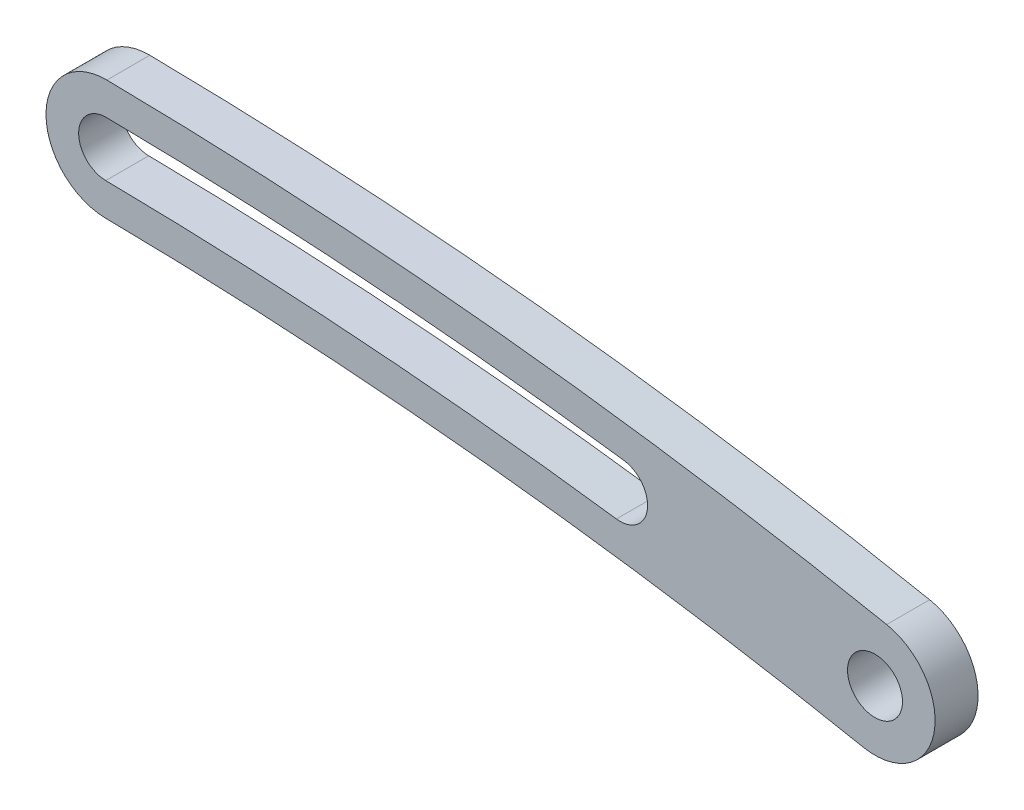
ISO-10303-21;
HEADER;
FILE_DESCRIPTION(('STEP AP214'),'2;1');
FILE_NAME('part.step','',(''),(''),'','','');
FILE_SCHEMA(('AUTOMOTIVE_DESIGN { 1 0 10303 214 1 1 1 1 }'));
ENDSEC;
DATA;
#1=APPLICATION_CONTEXT('core data for automotive mechanical design processes');
#2=APPLICATION_PROTOCOL_DEFINITION('international standard','automotive_design',2000,#1);
#3=PRODUCT_CONTEXT('',#1,'mechanical');
#4=PRODUCT('Part','Part','',(#3));
#5=PRODUCT_RELATED_PRODUCT_CATEGORY('part','',(#4));
#6=PRODUCT_DEFINITION_FORMATION('','',#4);
#7=PRODUCT_DEFINITION_CONTEXT('part definition',#1,'design');
#8=PRODUCT_DEFINITION('design','',#6,#7);
#9=PRODUCT_DEFINITION_SHAPE('','',#8);
#10=(LENGTH_UNIT() NAMED_UNIT(*) SI_UNIT(.MILLI.,.METRE.));
#11=(NAMED_UNIT(*) PLANE_ANGLE_UNIT() SI_UNIT($,.RADIAN.));
#12=(NAMED_UNIT(*) SI_UNIT($,.STERADIAN.) SOLID_ANGLE_UNIT());
#13=UNCERTAINTY_MEASURE_WITH_UNIT(LENGTH_MEASURE(1.E-05),#10,'distance_accuracy_value','');
#14=(GEOMETRIC_REPRESENTATION_CONTEXT(3) GLOBAL_UNCERTAINTY_ASSIGNED_CONTEXT((#13)) GLOBAL_UNIT_ASSIGNED_CONTEXT((#10,
#11,#12)) REPRESENTATION_CONTEXT('',''));
#15=CARTESIAN_POINT('',(0.,0.,0.));
#16=DIRECTION('',(0.,0.,1.));
#17=DIRECTION('',(1.,0.,0.));
#18=AXIS2_PLACEMENT_3D('',#15,#16,#17);
#19=CARTESIAN_POINT('',(6.11167054644832,112.284967293621,2.5));
#20=DIRECTION('',(0.,0.,-1.));
#21=DIRECTION('',(-1.,0.,0.));
#22=AXIS2_PLACEMENT_3D('',#19,#20,#21);
#23=CYLINDRICAL_SURFACE('',#22,3.5);
#24=CARTESIAN_POINT('',(6.11167054644832,112.284967293621,0.));
#25=DIRECTION('',(0.,0.,1.));
#26=DIRECTION('',(1.,0.,0.));
#27=AXIS2_PLACEMENT_3D('',#24,#25,#26);
#28=CIRCLE('',#27,3.5);
#29=CARTESIAN_POINT('',(5.43105399806817,108.851782021302,0.));
#30=VERTEX_POINT('',#29);
#31=CARTESIAN_POINT('',(6.79228709482846,115.718152565941,0.));
#32=VERTEX_POINT('',#31);
#33=EDGE_CURVE('E147',#30,#32,#28,.T.);
#34=ORIENTED_EDGE('',*,*,#33,.T.);
#35=DIRECTION('',(0.,0.,-1.));
#36=VECTOR('',#35,1.);
#37=CARTESIAN_POINT('',(6.79228709482846,115.718152565941,2.5));
#38=LINE('',#37,#36);
#39=CARTESIAN_POINT('',(6.79228709482846,115.718152565941,2.5));
#40=VERTEX_POINT('',#39);
#41=EDGE_CURVE('E11',#40,#32,#38,.T.);
#42=ORIENTED_EDGE('',*,*,#41,.F.);
#43=CARTESIAN_POINT('',(6.11167054644832,112.284967293621,2.5));
#44=DIRECTION('',(0.,0.,1.));
#45=DIRECTION('',(1.,0.,0.));
#46=AXIS2_PLACEMENT_3D('',#43,#44,#45);
#47=CIRCLE('',#46,3.5);
#48=CARTESIAN_POINT('',(5.43105399806817,108.851782021302,2.5));
#49=VERTEX_POINT('',#48);
#50=EDGE_CURVE('E115',#49,#40,#47,.T.);
#51=ORIENTED_EDGE('',*,*,#50,.F.);
#52=DIRECTION('',(0.,0.,-1.));
#53=VECTOR('',#52,1.);
#54=CARTESIAN_POINT('',(5.43105399806817,108.851782021302,2.5));
#55=LINE('',#54,#53);
#56=EDGE_CURVE('E54',#49,#30,#55,.T.);
#57=ORIENTED_EDGE('',*,*,#56,.T.);
#58=EDGE_LOOP('',(#34,#42,#51,#57));
#59=FACE_BOUND('',#58,.T.);
#60=ADVANCED_FACE('F35',(#59),#23,.T.);
#61=CARTESIAN_POINT('',(-41.8231806466106,-129.509366885448,2.5));
#62=DIRECTION('',(0.,0.,-1.));
#63=DIRECTION('',(-1.,0.,0.));
#64=AXIS2_PLACEMENT_3D('',#61,#62,#63);
#65=CYLINDRICAL_SURFACE('',#64,250.);
#66=CARTESIAN_POINT('',(-41.8231806466106,-129.509366885448,0.));
#67=DIRECTION('',(0.,0.,1.));
#68=DIRECTION('',(1.,0.,0.));
#69=AXIS2_PLACEMENT_3D('',#66,#67,#68);
#70=CIRCLE('',#69,250.);
#71=CARTESIAN_POINT('',(-38.59862410672,120.469836719814,0.));
#72=VERTEX_POINT('',#71);
#73=EDGE_CURVE('E121',#32,#72,#70,.T.);
#74=ORIENTED_EDGE('',*,*,#73,.T.);
#75=DIRECTION('',(0.,0.,-1.));
#76=VECTOR('',#75,1.);
#77=CARTESIAN_POINT('',(-38.59862410672,120.469836719814,2.5));
#78=LINE('',#77,#76);
#79=CARTESIAN_POINT('',(-38.59862410672,120.469836719814,2.5));
#80=VERTEX_POINT('',#79);
#81=EDGE_CURVE('E45',#80,#72,#78,.T.);
#82=ORIENTED_EDGE('',*,*,#81,.F.);
#83=CARTESIAN_POINT('',(-41.8231806466106,-129.509366885448,2.5));
#84=DIRECTION('',(0.,0.,1.));
#85=DIRECTION('',(1.,0.,0.));
#86=AXIS2_PLACEMENT_3D('',#83,#84,#85);
#87=CIRCLE('',#86,250.);
#88=EDGE_CURVE('E109',#40,#80,#87,.T.);
#89=ORIENTED_EDGE('',*,*,#88,.F.);
#90=ORIENTED_EDGE('',*,*,#41,.T.);
#91=EDGE_LOOP('',(#74,#82,#89,#90));
#92=FACE_BOUND('',#91,.T.);
#93=ADVANCED_FACE('F120',(#92),#65,.T.);
#94=CARTESIAN_POINT('',(-38.6437678982784,116.970127869341,2.5));
#95=DIRECTION('',(0.,0.,-1.));
#96=DIRECTION('',(-1.,0.,0.));
#97=AXIS2_PLACEMENT_3D('',#94,#95,#96);
#98=CYLINDRICAL_SURFACE('',#97,3.49999999999999);
#99=CARTESIAN_POINT('',(-38.6437678982784,116.970127869341,0.));
#100=DIRECTION('',(0.,0.,1.));
#101=DIRECTION('',(1.,0.,0.));
#102=AXIS2_PLACEMENT_3D('',#99,#100,#101);
#103=CIRCLE('',#102,3.49999999999999);
#104=CARTESIAN_POINT('',(-38.6889116898369,113.470419018867,0.));
#105=VERTEX_POINT('',#104);
#106=EDGE_CURVE('E150',#72,#105,#103,.T.);
#107=ORIENTED_EDGE('',*,*,#106,.T.);
#108=DIRECTION('',(0.,0.,-1.));
#109=VECTOR('',#108,1.);
#110=CARTESIAN_POINT('',(-38.6889116898369,113.470419018867,2.5));
#111=LINE('',#110,#109);
#112=CARTESIAN_POINT('',(-38.6889116898369,113.470419018867,2.5));
#113=VERTEX_POINT('',#112);
#114=EDGE_CURVE('E81',#113,#105,#111,.T.);
#115=ORIENTED_EDGE('',*,*,#114,.F.);
#116=CARTESIAN_POINT('',(-38.6437678982784,116.970127869341,2.5));
#117=DIRECTION('',(0.,0.,1.));
#118=DIRECTION('',(1.,0.,0.));
#119=AXIS2_PLACEMENT_3D('',#116,#117,#118);
#120=CIRCLE('',#119,3.49999999999999);
#121=EDGE_CURVE('E114',#80,#113,#120,.T.);
#122=ORIENTED_EDGE('',*,*,#121,.F.);
#123=ORIENTED_EDGE('',*,*,#81,.T.);
#124=EDGE_LOOP('',(#107,#115,#122,#123));
#125=FACE_BOUND('',#124,.T.);
#126=ADVANCED_FACE('F125',(#125),#98,.T.);
#127=CARTESIAN_POINT('',(-41.8231806466106,-129.509366885448,2.5));
#128=DIRECTION('',(0.,0.,-1.));
#129=DIRECTION('',(-1.,0.,0.));
#130=AXIS2_PLACEMENT_3D('',#127,#128,#129);
#131=CYLINDRICAL_SURFACE('',#130,248.1);
#132=CARTESIAN_POINT('',(-41.8231806466106,-129.509366885448,0.));
#133=DIRECTION('',(0.,0.,1.));
#134=DIRECTION('',(1.,0.,0.));
#135=AXIS2_PLACEMENT_3D('',#132,#133,#134);
#136=CIRCLE('',#135,248.1);
#137=CARTESIAN_POINT('',(-38.6231307364231,118.569994772414,0.));
#138=VERTEX_POINT('',#137);
#139=CARTESIAN_POINT('',(-8.51056771157319,116.344003682134,0.));
#140=VERTEX_POINT('',#139);
#141=EDGE_CURVE('E135',#138,#140,#136,.F.);
#142=ORIENTED_EDGE('',*,*,#141,.T.);
#143=DIRECTION('',(0.,0.,-1.));
#144=VECTOR('',#143,1.);
#145=CARTESIAN_POINT('',(-8.51056771157319,116.344003682134,2.5));
#146=LINE('',#145,#144);
#147=CARTESIAN_POINT('',(-8.51056771157319,116.344003682134,2.5));
#148=VERTEX_POINT('',#147);
#149=EDGE_CURVE('E39',#148,#140,#146,.T.);
#150=ORIENTED_EDGE('',*,*,#149,.F.);
#151=CARTESIAN_POINT('',(-41.8231806466106,-129.509366885448,2.5));
#152=DIRECTION('',(0.,0.,1.));
#153=DIRECTION('',(1.,0.,0.));
#154=AXIS2_PLACEMENT_3D('',#151,#152,#153);
#155=CIRCLE('',#154,248.1);
#156=CARTESIAN_POINT('',(-38.6231307364231,118.569994772414,2.5));
#157=VERTEX_POINT('',#156);
#158=EDGE_CURVE('E211',#157,#148,#155,.F.);
#159=ORIENTED_EDGE('',*,*,#158,.F.);
#160=DIRECTION('',(0.,0.,-1.));
#161=VECTOR('',#160,1.);
#162=CARTESIAN_POINT('',(-38.6231307364231,118.569994772414,2.5));
#163=LINE('',#162,#161);
#164=EDGE_CURVE('E128',#157,#138,#163,.T.);
#165=ORIENTED_EDGE('',*,*,#164,.T.);
#166=EDGE_LOOP('',(#142,#150,#159,#165));
#167=FACE_BOUND('',#166,.T.);
#168=ADVANCED_FACE('F169',(#167),#131,.F.);
#169=CARTESIAN_POINT('',(-8.72540116863108,114.758492223415,2.5));
#170=DIRECTION('',(0.,0.,-1.));
#171=DIRECTION('',(-1.,0.,0.));
#172=AXIS2_PLACEMENT_3D('',#169,#170,#171);
#173=CYLINDRICAL_SURFACE('',#172,1.60000000000002);
#174=CARTESIAN_POINT('',(-8.72540116863108,114.758492223415,0.));
#175=DIRECTION('',(0.,0.,1.));
#176=DIRECTION('',(1.,0.,0.));
#177=AXIS2_PLACEMENT_3D('',#174,#175,#176);
#178=CIRCLE('',#177,1.60000000000002);
#179=CARTESIAN_POINT('',(-8.94023462568895,113.172980764696,0.));
#180=VERTEX_POINT('',#179);
#181=EDGE_CURVE('E138',#140,#180,#178,.F.);
#182=ORIENTED_EDGE('',*,*,#181,.T.);
#183=DIRECTION('',(0.,0.,-1.));
#184=VECTOR('',#183,1.);
#185=CARTESIAN_POINT('',(-8.94023462568895,113.172980764696,2.5));
#186=LINE('',#185,#184);
#187=CARTESIAN_POINT('',(-8.94023462568895,113.172980764696,2.5));
#188=VERTEX_POINT('',#187);
#189=EDGE_CURVE('E160',#188,#180,#186,.T.);
#190=ORIENTED_EDGE('',*,*,#189,.F.);
#191=CARTESIAN_POINT('',(-8.72540116863108,114.758492223415,2.5));
#192=DIRECTION('',(0.,0.,1.));
#193=DIRECTION('',(1.,0.,0.));
#194=AXIS2_PLACEMENT_3D('',#191,#192,#193);
#195=CIRCLE('',#194,1.60000000000002);
#196=EDGE_CURVE('E94',#148,#188,#195,.F.);
#197=ORIENTED_EDGE('',*,*,#196,.F.);
#198=ORIENTED_EDGE('',*,*,#149,.T.);
#199=EDGE_LOOP('',(#182,#190,#197,#198));
#200=FACE_BOUND('',#199,.T.);
#201=ADVANCED_FACE('F165',(#200),#173,.F.);
#202=CARTESIAN_POINT('',(-41.8231806466106,-129.509366885448,2.5));
#203=DIRECTION('',(0.,0.,-1.));
#204=DIRECTION('',(-1.,0.,0.));
#205=AXIS2_PLACEMENT_3D('',#202,#203,#204);
#206=CYLINDRICAL_SURFACE('',#205,244.9);
#207=CARTESIAN_POINT('',(-41.8231806466106,-129.509366885448,0.));
#208=DIRECTION('',(0.,0.,1.));
#209=DIRECTION('',(1.,0.,0.));
#210=AXIS2_PLACEMENT_3D('',#207,#208,#209);
#211=CIRCLE('',#210,244.9);
#212=CARTESIAN_POINT('',(-38.6644050601337,115.370260966267,0.));
#213=VERTEX_POINT('',#212);
#214=EDGE_CURVE('E141',#213,#180,#211,.F.);
#215=ORIENTED_EDGE('',*,*,#214,.F.);
#216=DIRECTION('',(0.,0.,-1.));
#217=VECTOR('',#216,1.);
#218=CARTESIAN_POINT('',(-38.6644050601337,115.370260966267,2.5));
#219=LINE('',#218,#217);
#220=CARTESIAN_POINT('',(-38.6644050601337,115.370260966267,2.5));
#221=VERTEX_POINT('',#220);
#222=EDGE_CURVE('E159',#221,#213,#219,.T.);
#223=ORIENTED_EDGE('',*,*,#222,.F.);
#224=CARTESIAN_POINT('',(-41.8231806466106,-129.509366885448,2.5));
#225=DIRECTION('',(0.,0.,1.));
#226=DIRECTION('',(1.,0.,0.));
#227=AXIS2_PLACEMENT_3D('',#224,#225,#226);
#228=CIRCLE('',#227,244.9);
#229=EDGE_CURVE('E213',#221,#188,#228,.F.);
#230=ORIENTED_EDGE('',*,*,#229,.T.);
#231=ORIENTED_EDGE('',*,*,#189,.T.);
#232=EDGE_LOOP('',(#215,#223,#230,#231));
#233=FACE_BOUND('',#232,.T.);
#234=ADVANCED_FACE('F180',(#233),#206,.T.);
#235=CARTESIAN_POINT('',(-38.6437678982784,116.970127869341,2.5));
#236=DIRECTION('',(0.,0.,-1.));
#237=DIRECTION('',(-1.,0.,0.));
#238=AXIS2_PLACEMENT_3D('',#235,#236,#237);
#239=CYLINDRICAL_SURFACE('',#238,1.59999999999996);
#240=CARTESIAN_POINT('',(-38.6437678982784,116.970127869341,0.));
#241=DIRECTION('',(0.,0.,1.));
#242=DIRECTION('',(1.,0.,0.));
#243=AXIS2_PLACEMENT_3D('',#240,#241,#242);
#244=CIRCLE('',#243,1.59999999999996);
#245=EDGE_CURVE('E144',#138,#213,#244,.T.);
#246=ORIENTED_EDGE('',*,*,#245,.F.);
#247=ORIENTED_EDGE('',*,*,#164,.F.);
#248=CARTESIAN_POINT('',(-38.6437678982784,116.970127869341,2.5));
#249=DIRECTION('',(0.,0.,1.));
#250=DIRECTION('',(1.,0.,0.));
#251=AXIS2_PLACEMENT_3D('',#248,#249,#250);
#252=CIRCLE('',#251,1.59999999999996);
#253=EDGE_CURVE('E178',#157,#221,#252,.T.);
#254=ORIENTED_EDGE('',*,*,#253,.T.);
#255=ORIENTED_EDGE('',*,*,#222,.T.);
#256=EDGE_LOOP('',(#246,#247,#254,#255));
#257=FACE_BOUND('',#256,.T.);
#258=ADVANCED_FACE('F175',(#257),#239,.F.);
#259=CARTESIAN_POINT('',(6.11167054644832,112.284967293621,2.5));
#260=DIRECTION('',(0.,0.,-1.));
#261=DIRECTION('',(-1.,0.,0.));
#262=AXIS2_PLACEMENT_3D('',#259,#260,#261);
#263=CYLINDRICAL_SURFACE('',#262,1.6);
#264=CARTESIAN_POINT('',(6.11167054644832,112.284967293621,2.5));
#265=DIRECTION('',(0.,0.,1.));
#266=DIRECTION('',(1.,0.,0.));
#267=AXIS2_PLACEMENT_3D('',#264,#265,#266);
#268=CIRCLE('',#267,1.6);
#269=CARTESIAN_POINT('',(7.71167054644832,112.284967293621,2.5));
#270=VERTEX_POINT('',#269);
#271=EDGE_CURVE('E155',#270,#270,#268,.T.);
#272=ORIENTED_EDGE('',*,*,#271,.T.);
#273=EDGE_LOOP('',(#272));
#274=FACE_BOUND('',#273,.T.);
#275=CARTESIAN_POINT('',(6.11167054644832,112.284967293621,0.));
#276=DIRECTION('',(0.,0.,1.));
#277=DIRECTION('',(1.,0.,0.));
#278=AXIS2_PLACEMENT_3D('',#275,#276,#277);
#279=CIRCLE('',#278,1.6);
#280=CARTESIAN_POINT('',(7.71167054644832,112.284967293621,0.));
#281=VERTEX_POINT('',#280);
#282=EDGE_CURVE('E132',#281,#281,#279,.T.);
#283=ORIENTED_EDGE('',*,*,#282,.F.);
#284=EDGE_LOOP('',(#283));
#285=FACE_BOUND('',#284,.T.);
#286=ADVANCED_FACE('F37',(#274,#285),#263,.F.);
#287=CARTESIAN_POINT('',(-41.8231806466106,-129.509366885448,2.5));
#288=DIRECTION('',(0.,0.,-1.));
#289=DIRECTION('',(-1.,0.,0.));
#290=AXIS2_PLACEMENT_3D('',#287,#288,#289);
#291=CYLINDRICAL_SURFACE('',#290,243.);
#292=CARTESIAN_POINT('',(-41.8231806466106,-129.509366885448,0.));
#293=DIRECTION('',(0.,0.,1.));
#294=DIRECTION('',(1.,0.,0.));
#295=AXIS2_PLACEMENT_3D('',#292,#293,#294);
#296=CIRCLE('',#295,243.);
#297=EDGE_CURVE('E152',#30,#105,#296,.T.);
#298=ORIENTED_EDGE('',*,*,#297,.F.);
#299=ORIENTED_EDGE('',*,*,#56,.F.);
#300=CARTESIAN_POINT('',(-41.8231806466106,-129.509366885448,2.5));
#301=DIRECTION('',(0.,0.,1.));
#302=DIRECTION('',(1.,0.,0.));
#303=AXIS2_PLACEMENT_3D('',#300,#301,#302);
#304=CIRCLE('',#303,243.);
#305=EDGE_CURVE('E126',#49,#113,#304,.T.);
#306=ORIENTED_EDGE('',*,*,#305,.T.);
#307=ORIENTED_EDGE('',*,*,#114,.T.);
#308=EDGE_LOOP('',(#298,#299,#306,#307));
#309=FACE_BOUND('',#308,.T.);
#310=ADVANCED_FACE('F198',(#309),#291,.F.);
#311=CARTESIAN_POINT('',(0.,0.,2.5));
#312=DIRECTION('',(0.,0.,1.));
#313=DIRECTION('',(1.,0.,0.));
#314=AXIS2_PLACEMENT_3D('',#311,#312,#313);
#315=PLANE('',#314);
#316=ORIENTED_EDGE('',*,*,#271,.F.);
#317=EDGE_LOOP('',(#316));
#318=FACE_BOUND('',#317,.T.);
#319=ORIENTED_EDGE('',*,*,#158,.T.);
#320=ORIENTED_EDGE('',*,*,#196,.T.);
#321=ORIENTED_EDGE('',*,*,#229,.F.);
#322=ORIENTED_EDGE('',*,*,#253,.F.);
#323=EDGE_LOOP('',(#319,#320,#321,#322));
#324=FACE_BOUND('',#323,.T.);
#325=ORIENTED_EDGE('',*,*,#50,.T.);
#326=ORIENTED_EDGE('',*,*,#88,.T.);
#327=ORIENTED_EDGE('',*,*,#121,.T.);
#328=ORIENTED_EDGE('',*,*,#305,.F.);
#329=EDGE_LOOP('',(#325,#326,#327,#328));
#330=FACE_BOUND('',#329,.T.);
#331=ADVANCED_FACE('F111',(#318,#324,#330),#315,.T.);
#332=CARTESIAN_POINT('',(0.,0.,0.));
#333=DIRECTION('',(0.,0.,1.));
#334=DIRECTION('',(1.,0.,0.));
#335=AXIS2_PLACEMENT_3D('',#332,#333,#334);
#336=PLANE('',#335);
#337=ORIENTED_EDGE('',*,*,#282,.T.);
#338=EDGE_LOOP('',(#337));
#339=FACE_BOUND('',#338,.T.);
#340=ORIENTED_EDGE('',*,*,#141,.F.);
#341=ORIENTED_EDGE('',*,*,#245,.T.);
#342=ORIENTED_EDGE('',*,*,#214,.T.);
#343=ORIENTED_EDGE('',*,*,#181,.F.);
#344=EDGE_LOOP('',(#340,#341,#342,#343));
#345=FACE_BOUND('',#344,.T.);
#346=ORIENTED_EDGE('',*,*,#33,.F.);
#347=ORIENTED_EDGE('',*,*,#297,.T.);
#348=ORIENTED_EDGE('',*,*,#106,.F.);
#349=ORIENTED_EDGE('',*,*,#73,.F.);
#350=EDGE_LOOP('',(#346,#347,#348,#349));
#351=FACE_BOUND('',#350,.T.);
#352=ADVANCED_FACE('F172',(#339,#345,#351),#336,.F.);
#353=CLOSED_SHELL('',(#60,#93,#126,#168,#201,#234,#258,#286,#310,#331,#352));
#354=MANIFOLD_SOLID_BREP('B2',#353);
#355=ADVANCED_BREP_SHAPE_REPRESENTATION('',(#18,#354),#14);
#356=SHAPE_DEFINITION_REPRESENTATION(#9,#355);
ENDSEC;
END-ISO-10303-21;
